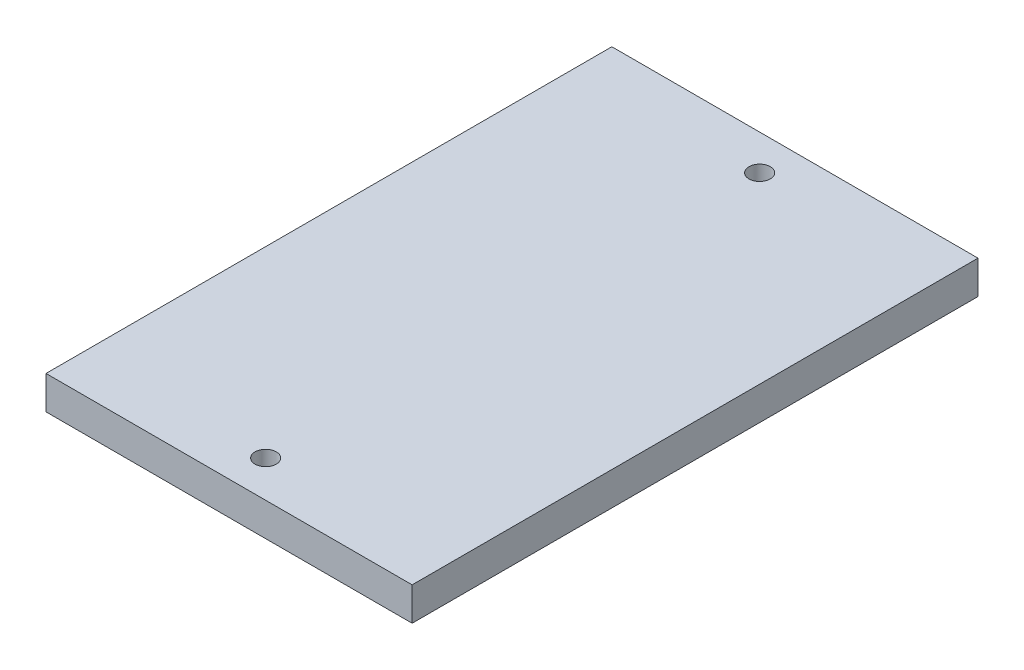
ISO-10303-21;
HEADER;
FILE_DESCRIPTION(('STEP AP214'),'2;1');
FILE_NAME('part.step','',(''),(''),'','','');
FILE_SCHEMA(('AUTOMOTIVE_DESIGN { 1 0 10303 214 1 1 1 1 }'));
ENDSEC;
DATA;
#1=APPLICATION_CONTEXT('core data for automotive mechanical design processes');
#2=APPLICATION_PROTOCOL_DEFINITION('international standard','automotive_design',2000,#1);
#3=PRODUCT_CONTEXT('',#1,'mechanical');
#4=PRODUCT('Part','Part','',(#3));
#5=PRODUCT_RELATED_PRODUCT_CATEGORY('part','',(#4));
#6=PRODUCT_DEFINITION_FORMATION('','',#4);
#7=PRODUCT_DEFINITION_CONTEXT('part definition',#1,'design');
#8=PRODUCT_DEFINITION('design','',#6,#7);
#9=PRODUCT_DEFINITION_SHAPE('','',#8);
#10=(LENGTH_UNIT() NAMED_UNIT(*) SI_UNIT(.MILLI.,.METRE.));
#11=(NAMED_UNIT(*) PLANE_ANGLE_UNIT() SI_UNIT($,.RADIAN.));
#12=(NAMED_UNIT(*) SI_UNIT($,.STERADIAN.) SOLID_ANGLE_UNIT());
#13=UNCERTAINTY_MEASURE_WITH_UNIT(LENGTH_MEASURE(1.E-05),#10,'distance_accuracy_value','');
#14=(GEOMETRIC_REPRESENTATION_CONTEXT(3) GLOBAL_UNCERTAINTY_ASSIGNED_CONTEXT((#13)) GLOBAL_UNIT_ASSIGNED_CONTEXT((#10,
#11,#12)) REPRESENTATION_CONTEXT('',''));
#15=CARTESIAN_POINT('',(0.,0.,0.));
#16=DIRECTION('',(0.,0.,1.));
#17=DIRECTION('',(1.,0.,0.));
#18=AXIS2_PLACEMENT_3D('',#15,#16,#17);
#19=CARTESIAN_POINT('',(0.,5.,0.));
#20=DIRECTION('',(0.,-1.,0.));
#21=DIRECTION('',(0.,0.,-1.));
#22=AXIS2_PLACEMENT_3D('',#19,#20,#21);
#23=PLANE('',#22);
#24=DIRECTION('',(0.,0.,-1.));
#25=VECTOR('',#24,1.);
#26=CARTESIAN_POINT('',(27.5,5.,42.5));
#27=LINE('',#26,#25);
#28=CARTESIAN_POINT('',(27.5,5.,42.5));
#29=VERTEX_POINT('',#28);
#30=CARTESIAN_POINT('',(27.5,5.,-42.5));
#31=VERTEX_POINT('',#30);
#32=EDGE_CURVE('E85',#29,#31,#27,.T.);
#33=ORIENTED_EDGE('',*,*,#32,.T.);
#34=DIRECTION('',(-1.,0.,0.));
#35=VECTOR('',#34,1.);
#36=CARTESIAN_POINT('',(-27.5,5.,-42.5));
#37=LINE('',#36,#35);
#38=CARTESIAN_POINT('',(-27.5,5.,-42.5));
#39=VERTEX_POINT('',#38);
#40=EDGE_CURVE('E80',#31,#39,#37,.T.);
#41=ORIENTED_EDGE('',*,*,#40,.T.);
#42=DIRECTION('',(0.,0.,1.));
#43=VECTOR('',#42,1.);
#44=CARTESIAN_POINT('',(-27.5,5.,42.5));
#45=LINE('',#44,#43);
#46=CARTESIAN_POINT('',(-27.5,5.,42.5));
#47=VERTEX_POINT('',#46);
#48=EDGE_CURVE('E83',#39,#47,#45,.T.);
#49=ORIENTED_EDGE('',*,*,#48,.T.);
#50=DIRECTION('',(1.,0.,0.));
#51=VECTOR('',#50,1.);
#52=CARTESIAN_POINT('',(-27.5,5.,42.5));
#53=LINE('',#52,#51);
#54=EDGE_CURVE('E50',#47,#29,#53,.T.);
#55=ORIENTED_EDGE('',*,*,#54,.T.);
#56=EDGE_LOOP('',(#33,#41,#49,#55));
#57=FACE_BOUND('',#56,.T.);
#58=CARTESIAN_POINT('',(0.,5.,37.));
#59=DIRECTION('',(0.,1.,0.));
#60=DIRECTION('',(0.,0.,1.));
#61=AXIS2_PLACEMENT_3D('',#58,#59,#60);
#62=CIRCLE('',#61,1.6);
#63=CARTESIAN_POINT('',(0.,5.,38.6));
#64=VERTEX_POINT('',#63);
#65=EDGE_CURVE('E100',#64,#64,#62,.T.);
#66=ORIENTED_EDGE('',*,*,#65,.F.);
#67=EDGE_LOOP('',(#66));
#68=FACE_BOUND('',#67,.T.);
#69=CARTESIAN_POINT('',(0.,5.,-37.2));
#70=DIRECTION('',(0.,1.,0.));
#71=DIRECTION('',(0.,0.,-1.));
#72=AXIS2_PLACEMENT_3D('',#69,#70,#71);
#73=CIRCLE('',#72,1.6);
#74=CARTESIAN_POINT('',(0.,5.,-38.8));
#75=VERTEX_POINT('',#74);
#76=EDGE_CURVE('E115',#75,#75,#73,.T.);
#77=ORIENTED_EDGE('',*,*,#76,.F.);
#78=EDGE_LOOP('',(#77));
#79=FACE_BOUND('',#78,.T.);
#80=ADVANCED_FACE('F33',(#57,#68,#79),#23,.F.);
#81=CARTESIAN_POINT('',(0.,0.,0.));
#82=DIRECTION('',(0.,-1.,0.));
#83=DIRECTION('',(0.,0.,-1.));
#84=AXIS2_PLACEMENT_3D('',#81,#82,#83);
#85=PLANE('',#84);
#86=CARTESIAN_POINT('',(0.,0.,37.));
#87=DIRECTION('',(0.,1.,0.));
#88=DIRECTION('',(0.,0.,1.));
#89=AXIS2_PLACEMENT_3D('',#86,#87,#88);
#90=CIRCLE('',#89,1.6);
#91=CARTESIAN_POINT('',(0.,0.,38.6));
#92=VERTEX_POINT('',#91);
#93=EDGE_CURVE('E112',#92,#92,#90,.T.);
#94=ORIENTED_EDGE('',*,*,#93,.T.);
#95=EDGE_LOOP('',(#94));
#96=FACE_BOUND('',#95,.T.);
#97=DIRECTION('',(0.,0.,-1.));
#98=VECTOR('',#97,1.);
#99=CARTESIAN_POINT('',(27.5,0.,42.5));
#100=LINE('',#99,#98);
#101=CARTESIAN_POINT('',(27.5,0.,42.5));
#102=VERTEX_POINT('',#101);
#103=CARTESIAN_POINT('',(27.5,0.,-42.5));
#104=VERTEX_POINT('',#103);
#105=EDGE_CURVE('E97',#102,#104,#100,.T.);
#106=ORIENTED_EDGE('',*,*,#105,.F.);
#107=DIRECTION('',(1.,0.,0.));
#108=VECTOR('',#107,1.);
#109=CARTESIAN_POINT('',(-27.5,0.,42.5));
#110=LINE('',#109,#108);
#111=CARTESIAN_POINT('',(-27.5,0.,42.5));
#112=VERTEX_POINT('',#111);
#113=EDGE_CURVE('E73',#112,#102,#110,.T.);
#114=ORIENTED_EDGE('',*,*,#113,.F.);
#115=DIRECTION('',(0.,0.,1.));
#116=VECTOR('',#115,1.);
#117=CARTESIAN_POINT('',(-27.5,0.,42.5));
#118=LINE('',#117,#116);
#119=CARTESIAN_POINT('',(-27.5,0.,-42.5));
#120=VERTEX_POINT('',#119);
#121=EDGE_CURVE('E67',#120,#112,#118,.T.);
#122=ORIENTED_EDGE('',*,*,#121,.F.);
#123=DIRECTION('',(-1.,0.,0.));
#124=VECTOR('',#123,1.);
#125=CARTESIAN_POINT('',(-27.5,0.,-42.5));
#126=LINE('',#125,#124);
#127=EDGE_CURVE('E89',#104,#120,#126,.T.);
#128=ORIENTED_EDGE('',*,*,#127,.F.);
#129=EDGE_LOOP('',(#106,#114,#122,#128));
#130=FACE_BOUND('',#129,.T.);
#131=CARTESIAN_POINT('',(0.,0.,-37.2));
#132=DIRECTION('',(0.,1.,0.));
#133=DIRECTION('',(0.,0.,-1.));
#134=AXIS2_PLACEMENT_3D('',#131,#132,#133);
#135=CIRCLE('',#134,1.6);
#136=CARTESIAN_POINT('',(0.,0.,-38.8));
#137=VERTEX_POINT('',#136);
#138=EDGE_CURVE('E118',#137,#137,#135,.T.);
#139=ORIENTED_EDGE('',*,*,#138,.T.);
#140=EDGE_LOOP('',(#139));
#141=FACE_BOUND('',#140,.T.);
#142=ADVANCED_FACE('F108',(#96,#130,#141),#85,.T.);
#143=CARTESIAN_POINT('',(27.5,5.,42.5));
#144=DIRECTION('',(-1.,0.,0.));
#145=DIRECTION('',(0.,0.,1.));
#146=AXIS2_PLACEMENT_3D('',#143,#144,#145);
#147=PLANE('',#146);
#148=ORIENTED_EDGE('',*,*,#105,.T.);
#149=DIRECTION('',(0.,-1.,0.));
#150=VECTOR('',#149,1.);
#151=CARTESIAN_POINT('',(27.5,5.,-42.5));
#152=LINE('',#151,#150);
#153=EDGE_CURVE('E11',#31,#104,#152,.T.);
#154=ORIENTED_EDGE('',*,*,#153,.F.);
#155=ORIENTED_EDGE('',*,*,#32,.F.);
#156=DIRECTION('',(0.,-1.,0.));
#157=VECTOR('',#156,1.);
#158=CARTESIAN_POINT('',(27.5,5.,42.5));
#159=LINE('',#158,#157);
#160=EDGE_CURVE('E93',#29,#102,#159,.T.);
#161=ORIENTED_EDGE('',*,*,#160,.T.);
#162=EDGE_LOOP('',(#148,#154,#155,#161));
#163=FACE_BOUND('',#162,.T.);
#164=ADVANCED_FACE('F35',(#163),#147,.F.);
#165=CARTESIAN_POINT('',(-27.5,5.,-42.5));
#166=DIRECTION('',(0.,0.,1.));
#167=DIRECTION('',(1.,0.,0.));
#168=AXIS2_PLACEMENT_3D('',#165,#166,#167);
#169=PLANE('',#168);
#170=ORIENTED_EDGE('',*,*,#127,.T.);
#171=DIRECTION('',(0.,-1.,0.));
#172=VECTOR('',#171,1.);
#173=CARTESIAN_POINT('',(-27.5,5.,-42.5));
#174=LINE('',#173,#172);
#175=EDGE_CURVE('E42',#39,#120,#174,.T.);
#176=ORIENTED_EDGE('',*,*,#175,.F.);
#177=ORIENTED_EDGE('',*,*,#40,.F.);
#178=ORIENTED_EDGE('',*,*,#153,.T.);
#179=EDGE_LOOP('',(#170,#176,#177,#178));
#180=FACE_BOUND('',#179,.T.);
#181=ADVANCED_FACE('F88',(#180),#169,.F.);
#182=CARTESIAN_POINT('',(-27.5,5.,42.5));
#183=DIRECTION('',(1.,0.,0.));
#184=DIRECTION('',(0.,0.,-1.));
#185=AXIS2_PLACEMENT_3D('',#182,#183,#184);
#186=PLANE('',#185);
#187=ORIENTED_EDGE('',*,*,#121,.T.);
#188=DIRECTION('',(0.,-1.,0.));
#189=VECTOR('',#188,1.);
#190=CARTESIAN_POINT('',(-27.5,5.,42.5));
#191=LINE('',#190,#189);
#192=EDGE_CURVE('E90',#47,#112,#191,.T.);
#193=ORIENTED_EDGE('',*,*,#192,.F.);
#194=ORIENTED_EDGE('',*,*,#48,.F.);
#195=ORIENTED_EDGE('',*,*,#175,.T.);
#196=EDGE_LOOP('',(#187,#193,#194,#195));
#197=FACE_BOUND('',#196,.T.);
#198=ADVANCED_FACE('F91',(#197),#186,.F.);
#199=CARTESIAN_POINT('',(-27.5,5.,42.5));
#200=DIRECTION('',(0.,0.,-1.));
#201=DIRECTION('',(-1.,0.,0.));
#202=AXIS2_PLACEMENT_3D('',#199,#200,#201);
#203=PLANE('',#202);
#204=ORIENTED_EDGE('',*,*,#113,.T.);
#205=ORIENTED_EDGE('',*,*,#160,.F.);
#206=ORIENTED_EDGE('',*,*,#54,.F.);
#207=ORIENTED_EDGE('',*,*,#192,.T.);
#208=EDGE_LOOP('',(#204,#205,#206,#207));
#209=FACE_BOUND('',#208,.T.);
#210=ADVANCED_FACE('F105',(#209),#203,.F.);
#211=CARTESIAN_POINT('',(0.,5.,37.));
#212=DIRECTION('',(0.,-1.,0.));
#213=DIRECTION('',(0.,0.,-1.));
#214=AXIS2_PLACEMENT_3D('',#211,#212,#213);
#215=CYLINDRICAL_SURFACE('',#214,1.6);
#216=ORIENTED_EDGE('',*,*,#65,.T.);
#217=EDGE_LOOP('',(#216));
#218=FACE_BOUND('',#217,.T.);
#219=ORIENTED_EDGE('',*,*,#93,.F.);
#220=EDGE_LOOP('',(#219));
#221=FACE_BOUND('',#220,.T.);
#222=ADVANCED_FACE('F135',(#218,#221),#215,.F.);
#223=CARTESIAN_POINT('',(0.,5.,-37.2));
#224=DIRECTION('',(0.,-1.,0.));
#225=DIRECTION('',(0.,0.,-1.));
#226=AXIS2_PLACEMENT_3D('',#223,#224,#225);
#227=CYLINDRICAL_SURFACE('',#226,1.6);
#228=ORIENTED_EDGE('',*,*,#76,.T.);
#229=EDGE_LOOP('',(#228));
#230=FACE_BOUND('',#229,.T.);
#231=ORIENTED_EDGE('',*,*,#138,.F.);
#232=EDGE_LOOP('',(#231));
#233=FACE_BOUND('',#232,.T.);
#234=ADVANCED_FACE('F124',(#230,#233),#227,.F.);
#235=CLOSED_SHELL('',(#80,#142,#164,#181,#198,#210,#222,#234));
#236=MANIFOLD_SOLID_BREP('B2',#235);
#237=ADVANCED_BREP_SHAPE_REPRESENTATION('',(#18,#236),#14);
#238=SHAPE_DEFINITION_REPRESENTATION(#9,#237);
ENDSEC;
END-ISO-10303-21;
